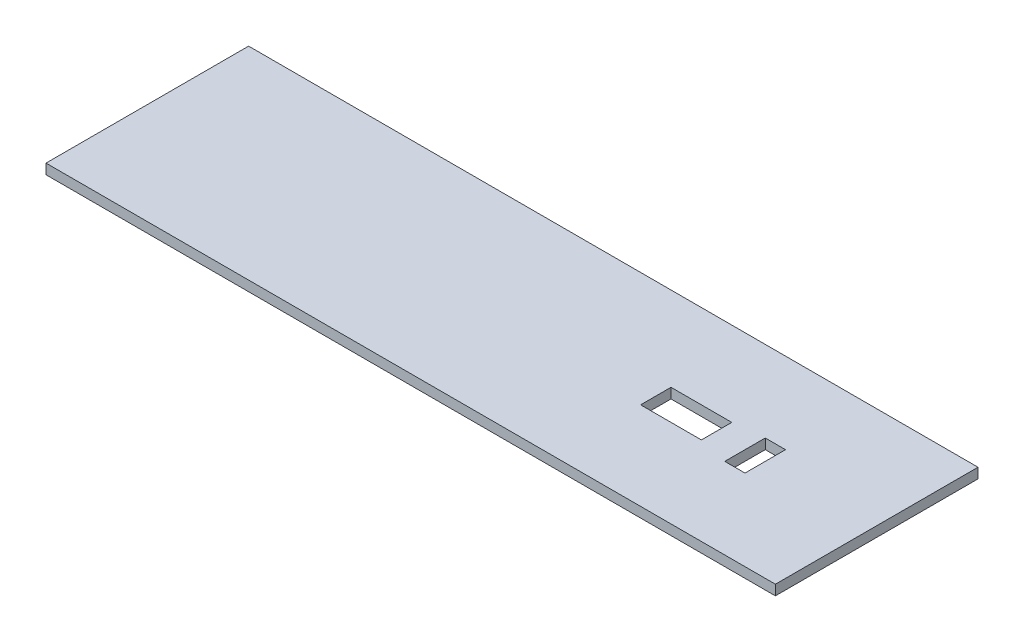
ISO-10303-21;
HEADER;
FILE_DESCRIPTION(('STEP AP214'),'2;1');
FILE_NAME('part.step','',(''),(''),'','','');
FILE_SCHEMA(('AUTOMOTIVE_DESIGN { 1 0 10303 214 1 1 1 1 }'));
ENDSEC;
DATA;
#1=APPLICATION_CONTEXT('core data for automotive mechanical design processes');
#2=APPLICATION_PROTOCOL_DEFINITION('international standard','automotive_design',2000,#1);
#3=PRODUCT_CONTEXT('',#1,'mechanical');
#4=PRODUCT('Part','Part','',(#3));
#5=PRODUCT_RELATED_PRODUCT_CATEGORY('part','',(#4));
#6=PRODUCT_DEFINITION_FORMATION('','',#4);
#7=PRODUCT_DEFINITION_CONTEXT('part definition',#1,'design');
#8=PRODUCT_DEFINITION('design','',#6,#7);
#9=PRODUCT_DEFINITION_SHAPE('','',#8);
#10=(LENGTH_UNIT() NAMED_UNIT(*) SI_UNIT(.MILLI.,.METRE.));
#11=(NAMED_UNIT(*) PLANE_ANGLE_UNIT() SI_UNIT($,.RADIAN.));
#12=(NAMED_UNIT(*) SI_UNIT($,.STERADIAN.) SOLID_ANGLE_UNIT());
#13=UNCERTAINTY_MEASURE_WITH_UNIT(LENGTH_MEASURE(1.E-05),#10,'distance_accuracy_value','');
#14=(GEOMETRIC_REPRESENTATION_CONTEXT(3) GLOBAL_UNCERTAINTY_ASSIGNED_CONTEXT((#13)) GLOBAL_UNIT_ASSIGNED_CONTEXT((#10,
#11,#12)) REPRESENTATION_CONTEXT('',''));
#15=CARTESIAN_POINT('',(0.,0.,0.));
#16=DIRECTION('',(0.,0.,1.));
#17=DIRECTION('',(1.,0.,0.));
#18=AXIS2_PLACEMENT_3D('',#15,#16,#17);
#19=CARTESIAN_POINT('',(360.,10.,100.));
#20=DIRECTION('',(-1.,0.,0.));
#21=DIRECTION('',(0.,0.,1.));
#22=AXIS2_PLACEMENT_3D('',#19,#20,#21);
#23=PLANE('',#22);
#24=DIRECTION('',(0.,0.,-1.));
#25=VECTOR('',#24,1.);
#26=CARTESIAN_POINT('',(360.,0.,100.));
#27=LINE('',#26,#25);
#28=CARTESIAN_POINT('',(360.,0.,100.));
#29=VERTEX_POINT('',#28);
#30=CARTESIAN_POINT('',(360.,0.,-100.));
#31=VERTEX_POINT('',#30);
#32=EDGE_CURVE('E183',#29,#31,#27,.T.);
#33=ORIENTED_EDGE('',*,*,#32,.T.);
#34=DIRECTION('',(0.,-1.,0.));
#35=VECTOR('',#34,1.);
#36=CARTESIAN_POINT('',(360.,10.,-100.));
#37=LINE('',#36,#35);
#38=CARTESIAN_POINT('',(360.,10.,-100.));
#39=VERTEX_POINT('',#38);
#40=EDGE_CURVE('E11',#39,#31,#37,.T.);
#41=ORIENTED_EDGE('',*,*,#40,.F.);
#42=DIRECTION('',(0.,0.,-1.));
#43=VECTOR('',#42,1.);
#44=CARTESIAN_POINT('',(360.,10.,100.));
#45=LINE('',#44,#43);
#46=CARTESIAN_POINT('',(360.,10.,100.));
#47=VERTEX_POINT('',#46);
#48=EDGE_CURVE('E190',#47,#39,#45,.T.);
#49=ORIENTED_EDGE('',*,*,#48,.F.);
#50=DIRECTION('',(0.,-1.,0.));
#51=VECTOR('',#50,1.);
#52=CARTESIAN_POINT('',(360.,10.,100.));
#53=LINE('',#52,#51);
#54=EDGE_CURVE('E200',#47,#29,#53,.T.);
#55=ORIENTED_EDGE('',*,*,#54,.T.);
#56=EDGE_LOOP('',(#33,#41,#49,#55));
#57=FACE_BOUND('',#56,.T.);
#58=ADVANCED_FACE('F33',(#57),#23,.F.);
#59=CARTESIAN_POINT('',(-360.,10.,-100.));
#60=DIRECTION('',(0.,0.,1.));
#61=DIRECTION('',(1.,0.,0.));
#62=AXIS2_PLACEMENT_3D('',#59,#60,#61);
#63=PLANE('',#62);
#64=DIRECTION('',(-1.,0.,0.));
#65=VECTOR('',#64,1.);
#66=CARTESIAN_POINT('',(-360.,0.,-100.));
#67=LINE('',#66,#65);
#68=CARTESIAN_POINT('',(-360.,0.,-100.));
#69=VERTEX_POINT('',#68);
#70=EDGE_CURVE('E203',#31,#69,#67,.T.);
#71=ORIENTED_EDGE('',*,*,#70,.T.);
#72=DIRECTION('',(0.,-1.,0.));
#73=VECTOR('',#72,1.);
#74=CARTESIAN_POINT('',(-360.,10.,-100.));
#75=LINE('',#74,#73);
#76=CARTESIAN_POINT('',(-360.,10.,-100.));
#77=VERTEX_POINT('',#76);
#78=EDGE_CURVE('E40',#77,#69,#75,.T.);
#79=ORIENTED_EDGE('',*,*,#78,.F.);
#80=DIRECTION('',(-1.,0.,0.));
#81=VECTOR('',#80,1.);
#82=CARTESIAN_POINT('',(-360.,10.,-100.));
#83=LINE('',#82,#81);
#84=EDGE_CURVE('E193',#39,#77,#83,.T.);
#85=ORIENTED_EDGE('',*,*,#84,.F.);
#86=ORIENTED_EDGE('',*,*,#40,.T.);
#87=EDGE_LOOP('',(#71,#79,#85,#86));
#88=FACE_BOUND('',#87,.T.);
#89=ADVANCED_FACE('F232',(#88),#63,.F.);
#90=CARTESIAN_POINT('',(-360.,10.,100.));
#91=DIRECTION('',(1.,0.,0.));
#92=DIRECTION('',(0.,0.,-1.));
#93=AXIS2_PLACEMENT_3D('',#90,#91,#92);
#94=PLANE('',#93);
#95=DIRECTION('',(0.,0.,1.));
#96=VECTOR('',#95,1.);
#97=CARTESIAN_POINT('',(-360.,0.,100.));
#98=LINE('',#97,#96);
#99=CARTESIAN_POINT('',(-360.,0.,100.));
#100=VERTEX_POINT('',#99);
#101=EDGE_CURVE('E205',#69,#100,#98,.T.);
#102=ORIENTED_EDGE('',*,*,#101,.T.);
#103=DIRECTION('',(0.,-1.,0.));
#104=VECTOR('',#103,1.);
#105=CARTESIAN_POINT('',(-360.,10.,100.));
#106=LINE('',#105,#104);
#107=CARTESIAN_POINT('',(-360.,10.,100.));
#108=VERTEX_POINT('',#107);
#109=EDGE_CURVE('E210',#108,#100,#106,.T.);
#110=ORIENTED_EDGE('',*,*,#109,.F.);
#111=DIRECTION('',(0.,0.,1.));
#112=VECTOR('',#111,1.);
#113=CARTESIAN_POINT('',(-360.,10.,100.));
#114=LINE('',#113,#112);
#115=EDGE_CURVE('E196',#77,#108,#114,.T.);
#116=ORIENTED_EDGE('',*,*,#115,.F.);
#117=ORIENTED_EDGE('',*,*,#78,.T.);
#118=EDGE_LOOP('',(#102,#110,#116,#117));
#119=FACE_BOUND('',#118,.T.);
#120=ADVANCED_FACE('F217',(#119),#94,.F.);
#121=CARTESIAN_POINT('',(-360.,10.,100.));
#122=DIRECTION('',(0.,0.,-1.));
#123=DIRECTION('',(-1.,0.,0.));
#124=AXIS2_PLACEMENT_3D('',#121,#122,#123);
#125=PLANE('',#124);
#126=DIRECTION('',(1.,0.,0.));
#127=VECTOR('',#126,1.);
#128=CARTESIAN_POINT('',(-360.,0.,100.));
#129=LINE('',#128,#127);
#130=EDGE_CURVE('E194',#100,#29,#129,.T.);
#131=ORIENTED_EDGE('',*,*,#130,.T.);
#132=ORIENTED_EDGE('',*,*,#54,.F.);
#133=DIRECTION('',(1.,0.,0.));
#134=VECTOR('',#133,1.);
#135=CARTESIAN_POINT('',(-360.,10.,100.));
#136=LINE('',#135,#134);
#137=EDGE_CURVE('E198',#108,#47,#136,.T.);
#138=ORIENTED_EDGE('',*,*,#137,.F.);
#139=ORIENTED_EDGE('',*,*,#109,.T.);
#140=EDGE_LOOP('',(#131,#132,#138,#139));
#141=FACE_BOUND('',#140,.T.);
#142=ADVANCED_FACE('F225',(#141),#125,.F.);
#143=CARTESIAN_POINT('',(0.,10.,0.));
#144=DIRECTION('',(0.,-1.,0.));
#145=DIRECTION('',(0.,0.,-1.));
#146=AXIS2_PLACEMENT_3D('',#143,#144,#145);
#147=PLANE('',#146);
#148=DIRECTION('',(0.,0.,-1.));
#149=VECTOR('',#148,1.);
#150=CARTESIAN_POINT('',(200.145843921184,10.,13.1845079937975));
#151=LINE('',#150,#149);
#152=CARTESIAN_POINT('',(200.145843921184,10.,13.1845079937975));
#153=VERTEX_POINT('',#152);
#154=CARTESIAN_POINT('',(200.145843921184,10.,-16.8154920062025));
#155=VERTEX_POINT('',#154);
#156=EDGE_CURVE('E145',#153,#155,#151,.T.);
#157=ORIENTED_EDGE('',*,*,#156,.F.);
#158=DIRECTION('',(1.,0.,0.));
#159=VECTOR('',#158,1.);
#160=CARTESIAN_POINT('',(140.145843921184,10.,13.1845079937975));
#161=LINE('',#160,#159);
#162=CARTESIAN_POINT('',(140.145843921184,10.,13.1845079937975));
#163=VERTEX_POINT('',#162);
#164=EDGE_CURVE('E138',#163,#153,#161,.T.);
#165=ORIENTED_EDGE('',*,*,#164,.F.);
#166=DIRECTION('',(0.,0.,1.));
#167=VECTOR('',#166,1.);
#168=CARTESIAN_POINT('',(140.145843921184,10.,13.1845079937975));
#169=LINE('',#168,#167);
#170=CARTESIAN_POINT('',(140.145843921184,10.,-16.8154920062025));
#171=VERTEX_POINT('',#170);
#172=EDGE_CURVE('E149',#171,#163,#169,.T.);
#173=ORIENTED_EDGE('',*,*,#172,.F.);
#174=DIRECTION('',(-1.,0.,0.));
#175=VECTOR('',#174,1.);
#176=CARTESIAN_POINT('',(140.145843921184,10.,-16.8154920062025));
#177=LINE('',#176,#175);
#178=EDGE_CURVE('E47',#155,#171,#177,.T.);
#179=ORIENTED_EDGE('',*,*,#178,.F.);
#180=EDGE_LOOP('',(#157,#165,#173,#179));
#181=FACE_BOUND('',#180,.T.);
#182=DIRECTION('',(-1.,0.,0.));
#183=VECTOR('',#182,1.);
#184=CARTESIAN_POINT('',(250.,10.,-20.));
#185=LINE('',#184,#183);
#186=CARTESIAN_POINT('',(250.,10.,-20.));
#187=VERTEX_POINT('',#186);
#188=CARTESIAN_POINT('',(230.,10.,-20.));
#189=VERTEX_POINT('',#188);
#190=EDGE_CURVE('E169',#187,#189,#185,.T.);
#191=ORIENTED_EDGE('',*,*,#190,.F.);
#192=DIRECTION('',(0.,0.,1.));
#193=VECTOR('',#192,1.);
#194=CARTESIAN_POINT('',(250.,10.,-20.));
#195=LINE('',#194,#193);
#196=CARTESIAN_POINT('',(250.,10.,20.));
#197=VERTEX_POINT('',#196);
#198=EDGE_CURVE('E159',#187,#197,#195,.T.);
#199=ORIENTED_EDGE('',*,*,#198,.T.);
#200=DIRECTION('',(-1.,0.,0.));
#201=VECTOR('',#200,1.);
#202=CARTESIAN_POINT('',(250.,10.,20.));
#203=LINE('',#202,#201);
#204=CARTESIAN_POINT('',(230.,10.,20.));
#205=VERTEX_POINT('',#204);
#206=EDGE_CURVE('E162',#197,#205,#203,.T.);
#207=ORIENTED_EDGE('',*,*,#206,.T.);
#208=DIRECTION('',(0.,0.,1.));
#209=VECTOR('',#208,1.);
#210=CARTESIAN_POINT('',(230.,10.,-20.));
#211=LINE('',#210,#209);
#212=EDGE_CURVE('E166',#189,#205,#211,.T.);
#213=ORIENTED_EDGE('',*,*,#212,.F.);
#214=EDGE_LOOP('',(#191,#199,#207,#213));
#215=FACE_BOUND('',#214,.T.);
#216=ORIENTED_EDGE('',*,*,#48,.T.);
#217=ORIENTED_EDGE('',*,*,#84,.T.);
#218=ORIENTED_EDGE('',*,*,#115,.T.);
#219=ORIENTED_EDGE('',*,*,#137,.T.);
#220=EDGE_LOOP('',(#216,#217,#218,#219));
#221=FACE_BOUND('',#220,.T.);
#222=ADVANCED_FACE('F231',(#181,#215,#221),#147,.F.);
#223=CARTESIAN_POINT('',(0.,0.,0.));
#224=DIRECTION('',(0.,-1.,0.));
#225=DIRECTION('',(0.,0.,-1.));
#226=AXIS2_PLACEMENT_3D('',#223,#224,#225);
#227=PLANE('',#226);
#228=DIRECTION('',(1.,0.,0.));
#229=VECTOR('',#228,1.);
#230=CARTESIAN_POINT('',(140.145843921184,0.,13.1845079937975));
#231=LINE('',#230,#229);
#232=CARTESIAN_POINT('',(140.145843921184,0.,13.1845079937975));
#233=VERTEX_POINT('',#232);
#234=CARTESIAN_POINT('',(200.145843921184,0.,13.1845079937975));
#235=VERTEX_POINT('',#234);
#236=EDGE_CURVE('E135',#233,#235,#231,.T.);
#237=ORIENTED_EDGE('',*,*,#236,.T.);
#238=DIRECTION('',(0.,0.,-1.));
#239=VECTOR('',#238,1.);
#240=CARTESIAN_POINT('',(200.145843921184,0.,13.1845079937975));
#241=LINE('',#240,#239);
#242=CARTESIAN_POINT('',(200.145843921184,0.,-16.8154920062025));
#243=VERTEX_POINT('',#242);
#244=EDGE_CURVE('E122',#235,#243,#241,.T.);
#245=ORIENTED_EDGE('',*,*,#244,.T.);
#246=DIRECTION('',(-1.,0.,0.));
#247=VECTOR('',#246,1.);
#248=CARTESIAN_POINT('',(140.145843921184,0.,-16.8154920062025));
#249=LINE('',#248,#247);
#250=CARTESIAN_POINT('',(140.145843921184,0.,-16.8154920062025));
#251=VERTEX_POINT('',#250);
#252=EDGE_CURVE('E153',#243,#251,#249,.T.);
#253=ORIENTED_EDGE('',*,*,#252,.T.);
#254=DIRECTION('',(0.,0.,1.));
#255=VECTOR('',#254,1.);
#256=CARTESIAN_POINT('',(140.145843921184,0.,13.1845079937975));
#257=LINE('',#256,#255);
#258=EDGE_CURVE('E143',#251,#233,#257,.T.);
#259=ORIENTED_EDGE('',*,*,#258,.T.);
#260=EDGE_LOOP('',(#237,#245,#253,#259));
#261=FACE_BOUND('',#260,.T.);
#262=DIRECTION('',(0.,0.,1.));
#263=VECTOR('',#262,1.);
#264=CARTESIAN_POINT('',(250.,0.,-20.));
#265=LINE('',#264,#263);
#266=CARTESIAN_POINT('',(250.,0.,-20.));
#267=VERTEX_POINT('',#266);
#268=CARTESIAN_POINT('',(250.,0.,20.));
#269=VERTEX_POINT('',#268);
#270=EDGE_CURVE('E158',#267,#269,#265,.T.);
#271=ORIENTED_EDGE('',*,*,#270,.F.);
#272=DIRECTION('',(-1.,0.,0.));
#273=VECTOR('',#272,1.);
#274=CARTESIAN_POINT('',(250.,0.,-20.));
#275=LINE('',#274,#273);
#276=CARTESIAN_POINT('',(230.,0.,-20.));
#277=VERTEX_POINT('',#276);
#278=EDGE_CURVE('E163',#267,#277,#275,.T.);
#279=ORIENTED_EDGE('',*,*,#278,.T.);
#280=DIRECTION('',(0.,0.,1.));
#281=VECTOR('',#280,1.);
#282=CARTESIAN_POINT('',(230.,0.,-20.));
#283=LINE('',#282,#281);
#284=CARTESIAN_POINT('',(230.,0.,20.));
#285=VERTEX_POINT('',#284);
#286=EDGE_CURVE('E176',#277,#285,#283,.T.);
#287=ORIENTED_EDGE('',*,*,#286,.T.);
#288=DIRECTION('',(-1.,0.,0.));
#289=VECTOR('',#288,1.);
#290=CARTESIAN_POINT('',(250.,0.,20.));
#291=LINE('',#290,#289);
#292=EDGE_CURVE('E173',#269,#285,#291,.T.);
#293=ORIENTED_EDGE('',*,*,#292,.F.);
#294=EDGE_LOOP('',(#271,#279,#287,#293));
#295=FACE_BOUND('',#294,.T.);
#296=ORIENTED_EDGE('',*,*,#32,.F.);
#297=ORIENTED_EDGE('',*,*,#130,.F.);
#298=ORIENTED_EDGE('',*,*,#101,.F.);
#299=ORIENTED_EDGE('',*,*,#70,.F.);
#300=EDGE_LOOP('',(#296,#297,#298,#299));
#301=FACE_BOUND('',#300,.T.);
#302=ADVANCED_FACE('F141',(#261,#295,#301),#227,.T.);
#303=CARTESIAN_POINT('',(250.,10.,-20.));
#304=DIRECTION('',(1.,0.,0.));
#305=DIRECTION('',(0.,0.,-1.));
#306=AXIS2_PLACEMENT_3D('',#303,#304,#305);
#307=PLANE('',#306);
#308=ORIENTED_EDGE('',*,*,#270,.T.);
#309=DIRECTION('',(0.,-1.,0.));
#310=VECTOR('',#309,1.);
#311=CARTESIAN_POINT('',(250.,10.,20.));
#312=LINE('',#311,#310);
#313=EDGE_CURVE('E171',#197,#269,#312,.T.);
#314=ORIENTED_EDGE('',*,*,#313,.F.);
#315=ORIENTED_EDGE('',*,*,#198,.F.);
#316=DIRECTION('',(0.,-1.,0.));
#317=VECTOR('',#316,1.);
#318=CARTESIAN_POINT('',(250.,10.,-20.));
#319=LINE('',#318,#317);
#320=EDGE_CURVE('E181',#187,#267,#319,.T.);
#321=ORIENTED_EDGE('',*,*,#320,.T.);
#322=EDGE_LOOP('',(#308,#314,#315,#321));
#323=FACE_BOUND('',#322,.T.);
#324=ADVANCED_FACE('F244',(#323),#307,.F.);
#325=CARTESIAN_POINT('',(250.,10.,-20.));
#326=DIRECTION('',(0.,0.,1.));
#327=DIRECTION('',(1.,0.,0.));
#328=AXIS2_PLACEMENT_3D('',#325,#326,#327);
#329=PLANE('',#328);
#330=ORIENTED_EDGE('',*,*,#278,.F.);
#331=ORIENTED_EDGE('',*,*,#320,.F.);
#332=ORIENTED_EDGE('',*,*,#190,.T.);
#333=DIRECTION('',(0.,-1.,0.));
#334=VECTOR('',#333,1.);
#335=CARTESIAN_POINT('',(230.,10.,-20.));
#336=LINE('',#335,#334);
#337=EDGE_CURVE('E184',#189,#277,#336,.T.);
#338=ORIENTED_EDGE('',*,*,#337,.T.);
#339=EDGE_LOOP('',(#330,#331,#332,#338));
#340=FACE_BOUND('',#339,.T.);
#341=ADVANCED_FACE('F250',(#340),#329,.T.);
#342=CARTESIAN_POINT('',(230.,10.,-20.));
#343=DIRECTION('',(1.,0.,0.));
#344=DIRECTION('',(0.,0.,-1.));
#345=AXIS2_PLACEMENT_3D('',#342,#343,#344);
#346=PLANE('',#345);
#347=ORIENTED_EDGE('',*,*,#286,.F.);
#348=ORIENTED_EDGE('',*,*,#337,.F.);
#349=ORIENTED_EDGE('',*,*,#212,.T.);
#350=DIRECTION('',(0.,-1.,0.));
#351=VECTOR('',#350,1.);
#352=CARTESIAN_POINT('',(230.,10.,20.));
#353=LINE('',#352,#351);
#354=EDGE_CURVE('E186',#205,#285,#353,.T.);
#355=ORIENTED_EDGE('',*,*,#354,.T.);
#356=EDGE_LOOP('',(#347,#348,#349,#355));
#357=FACE_BOUND('',#356,.T.);
#358=ADVANCED_FACE('F255',(#357),#346,.T.);
#359=CARTESIAN_POINT('',(250.,10.,20.));
#360=DIRECTION('',(0.,0.,1.));
#361=DIRECTION('',(1.,0.,0.));
#362=AXIS2_PLACEMENT_3D('',#359,#360,#361);
#363=PLANE('',#362);
#364=ORIENTED_EDGE('',*,*,#292,.T.);
#365=ORIENTED_EDGE('',*,*,#354,.F.);
#366=ORIENTED_EDGE('',*,*,#206,.F.);
#367=ORIENTED_EDGE('',*,*,#313,.T.);
#368=EDGE_LOOP('',(#364,#365,#366,#367));
#369=FACE_BOUND('',#368,.T.);
#370=ADVANCED_FACE('F252',(#369),#363,.F.);
#371=CARTESIAN_POINT('',(140.145843921184,-67.0820393249937,13.1845079937975));
#372=DIRECTION('',(0.,0.,1.));
#373=DIRECTION('',(1.,0.,0.));
#374=AXIS2_PLACEMENT_3D('',#371,#372,#373);
#375=PLANE('',#374);
#376=DIRECTION('',(0.,1.,0.));
#377=VECTOR('',#376,1.);
#378=CARTESIAN_POINT('',(140.145843921184,-67.0820393249937,13.1845079937975));
#379=LINE('',#378,#377);
#380=EDGE_CURVE('E55',#233,#163,#379,.T.);
#381=ORIENTED_EDGE('',*,*,#380,.T.);
#382=ORIENTED_EDGE('',*,*,#164,.T.);
#383=DIRECTION('',(0.,1.,0.));
#384=VECTOR('',#383,1.);
#385=CARTESIAN_POINT('',(200.145843921184,-67.0820393249937,13.1845079937975));
#386=LINE('',#385,#384);
#387=EDGE_CURVE('E126',#235,#153,#386,.T.);
#388=ORIENTED_EDGE('',*,*,#387,.F.);
#389=ORIENTED_EDGE('',*,*,#236,.F.);
#390=EDGE_LOOP('',(#381,#382,#388,#389));
#391=FACE_BOUND('',#390,.T.);
#392=ADVANCED_FACE('F134',(#391),#375,.F.);
#393=CARTESIAN_POINT('',(200.145843921184,-67.0820393249937,13.1845079937975));
#394=DIRECTION('',(1.,0.,0.));
#395=DIRECTION('',(0.,0.,-1.));
#396=AXIS2_PLACEMENT_3D('',#393,#394,#395);
#397=PLANE('',#396);
#398=ORIENTED_EDGE('',*,*,#387,.T.);
#399=ORIENTED_EDGE('',*,*,#156,.T.);
#400=DIRECTION('',(0.,1.,0.));
#401=VECTOR('',#400,1.);
#402=CARTESIAN_POINT('',(200.145843921184,-67.0820393249937,-16.8154920062025));
#403=LINE('',#402,#401);
#404=EDGE_CURVE('E128',#243,#155,#403,.T.);
#405=ORIENTED_EDGE('',*,*,#404,.F.);
#406=ORIENTED_EDGE('',*,*,#244,.F.);
#407=EDGE_LOOP('',(#398,#399,#405,#406));
#408=FACE_BOUND('',#407,.T.);
#409=ADVANCED_FACE('F124',(#408),#397,.F.);
#410=CARTESIAN_POINT('',(140.145843921184,-67.0820393249937,-16.8154920062025));
#411=DIRECTION('',(0.,0.,-1.));
#412=DIRECTION('',(-1.,0.,0.));
#413=AXIS2_PLACEMENT_3D('',#410,#411,#412);
#414=PLANE('',#413);
#415=ORIENTED_EDGE('',*,*,#404,.T.);
#416=ORIENTED_EDGE('',*,*,#178,.T.);
#417=DIRECTION('',(0.,1.,0.));
#418=VECTOR('',#417,1.);
#419=CARTESIAN_POINT('',(140.145843921184,-67.0820393249937,-16.8154920062025));
#420=LINE('',#419,#418);
#421=EDGE_CURVE('E152',#251,#171,#420,.T.);
#422=ORIENTED_EDGE('',*,*,#421,.F.);
#423=ORIENTED_EDGE('',*,*,#252,.F.);
#424=EDGE_LOOP('',(#415,#416,#422,#423));
#425=FACE_BOUND('',#424,.T.);
#426=ADVANCED_FACE('F267',(#425),#414,.F.);
#427=CARTESIAN_POINT('',(140.145843921184,-67.0820393249937,13.1845079937975));
#428=DIRECTION('',(-1.,0.,0.));
#429=DIRECTION('',(0.,0.,1.));
#430=AXIS2_PLACEMENT_3D('',#427,#428,#429);
#431=PLANE('',#430);
#432=ORIENTED_EDGE('',*,*,#421,.T.);
#433=ORIENTED_EDGE('',*,*,#172,.T.);
#434=ORIENTED_EDGE('',*,*,#380,.F.);
#435=ORIENTED_EDGE('',*,*,#258,.F.);
#436=EDGE_LOOP('',(#432,#433,#434,#435));
#437=FACE_BOUND('',#436,.T.);
#438=ADVANCED_FACE('F270',(#437),#431,.F.);
#439=CLOSED_SHELL('',(#58,#89,#120,#142,#222,#302,#324,#341,#358,#370,#392,#409,#426,#438));
#440=MANIFOLD_SOLID_BREP('B2',#439);
#441=ADVANCED_BREP_SHAPE_REPRESENTATION('',(#18,#440),#14);
#442=SHAPE_DEFINITION_REPRESENTATION(#9,#441);
ENDSEC;
END-ISO-10303-21;
